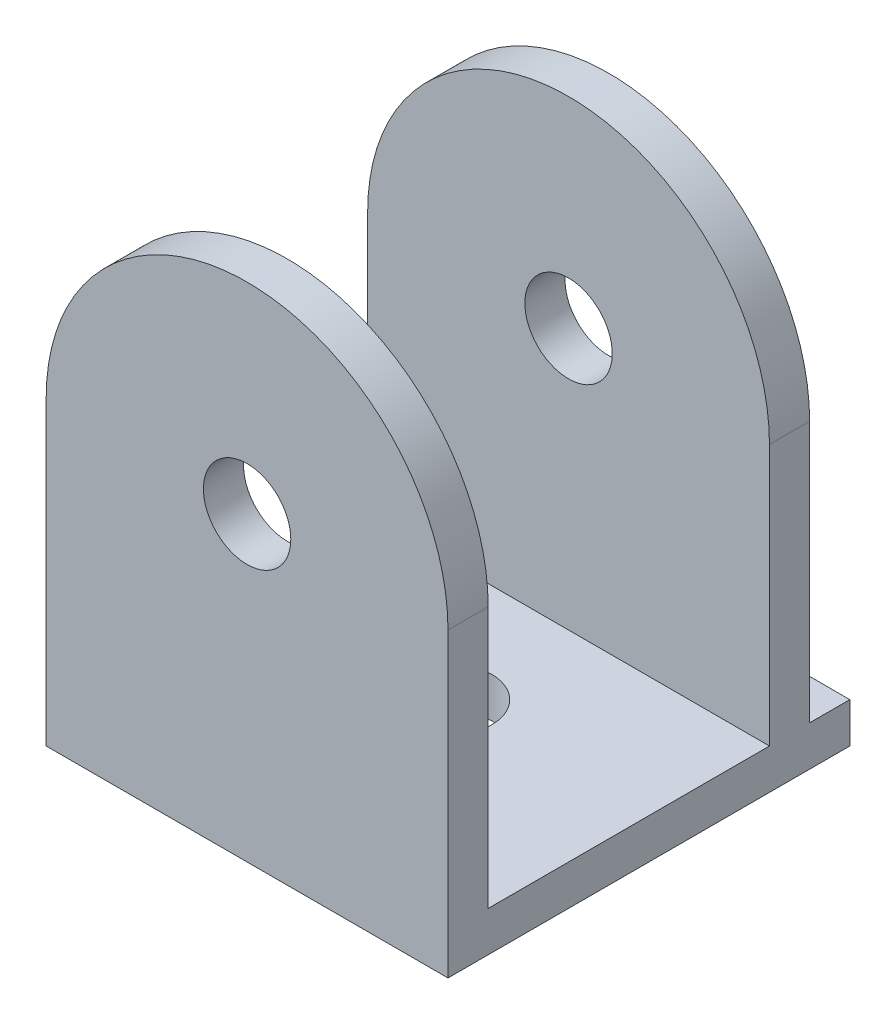
ISO-10303-21;
HEADER;
FILE_DESCRIPTION(('STEP AP214'),'2;1');
FILE_NAME('part.step','',(''),(''),'','','');
FILE_SCHEMA(('AUTOMOTIVE_DESIGN { 1 0 10303 214 1 1 1 1 }'));
ENDSEC;
DATA;
#1=APPLICATION_CONTEXT('core data for automotive mechanical design processes');
#2=APPLICATION_PROTOCOL_DEFINITION('international standard','automotive_design',2000,#1);
#3=PRODUCT_CONTEXT('',#1,'mechanical');
#4=PRODUCT('Part','Part','',(#3));
#5=PRODUCT_RELATED_PRODUCT_CATEGORY('part','',(#4));
#6=PRODUCT_DEFINITION_FORMATION('','',#4);
#7=PRODUCT_DEFINITION_CONTEXT('part definition',#1,'design');
#8=PRODUCT_DEFINITION('design','',#6,#7);
#9=PRODUCT_DEFINITION_SHAPE('','',#8);
#10=(LENGTH_UNIT() NAMED_UNIT(*) SI_UNIT(.MILLI.,.METRE.));
#11=(NAMED_UNIT(*) PLANE_ANGLE_UNIT() SI_UNIT($,.RADIAN.));
#12=(NAMED_UNIT(*) SI_UNIT($,.STERADIAN.) SOLID_ANGLE_UNIT());
#13=UNCERTAINTY_MEASURE_WITH_UNIT(LENGTH_MEASURE(1.E-05),#10,'distance_accuracy_value','');
#14=(GEOMETRIC_REPRESENTATION_CONTEXT(3) GLOBAL_UNCERTAINTY_ASSIGNED_CONTEXT((#13)) GLOBAL_UNIT_ASSIGNED_CONTEXT((#10,
#11,#12)) REPRESENTATION_CONTEXT('',''));
#15=CARTESIAN_POINT('',(0.,0.,0.));
#16=DIRECTION('',(0.,0.,1.));
#17=DIRECTION('',(1.,0.,0.));
#18=AXIS2_PLACEMENT_3D('',#15,#16,#17);
#19=CARTESIAN_POINT('',(0.,30.,20.));
#20=DIRECTION('',(0.,0.,-1.));
#21=DIRECTION('',(-1.,0.,0.));
#22=AXIS2_PLACEMENT_3D('',#19,#20,#21);
#23=CYLINDRICAL_SURFACE('',#22,20.);
#24=CARTESIAN_POINT('',(0.,30.,16.));
#25=DIRECTION('',(0.,0.,1.));
#26=DIRECTION('',(0.,-1.,0.));
#27=AXIS2_PLACEMENT_3D('',#24,#25,#26);
#28=CIRCLE('',#27,20.);
#29=CARTESIAN_POINT('',(-20.,30.,16.));
#30=VERTEX_POINT('',#29);
#31=CARTESIAN_POINT('',(20.,30.,16.));
#32=VERTEX_POINT('',#31);
#33=EDGE_CURVE('E166',#30,#32,#28,.F.);
#34=ORIENTED_EDGE('',*,*,#33,.F.);
#35=DIRECTION('',(0.,0.,-1.));
#36=VECTOR('',#35,1.);
#37=CARTESIAN_POINT('',(-20.,30.,20.));
#38=LINE('',#37,#36);
#39=CARTESIAN_POINT('',(-20.,30.,20.));
#40=VERTEX_POINT('',#39);
#41=EDGE_CURVE('E49',#40,#30,#38,.T.);
#42=ORIENTED_EDGE('',*,*,#41,.F.);
#43=CARTESIAN_POINT('',(0.,30.,20.));
#44=DIRECTION('',(0.,0.,1.));
#45=DIRECTION('',(1.,0.,0.));
#46=AXIS2_PLACEMENT_3D('',#43,#44,#45);
#47=CIRCLE('',#46,20.);
#48=CARTESIAN_POINT('',(20.,30.,20.));
#49=VERTEX_POINT('',#48);
#50=EDGE_CURVE('E171',#40,#49,#47,.F.);
#51=ORIENTED_EDGE('',*,*,#50,.T.);
#52=DIRECTION('',(0.,0.,-1.));
#53=VECTOR('',#52,1.);
#54=CARTESIAN_POINT('',(20.,30.,20.));
#55=LINE('',#54,#53);
#56=EDGE_CURVE('E190',#49,#32,#55,.T.);
#57=ORIENTED_EDGE('',*,*,#56,.T.);
#58=EDGE_LOOP('',(#34,#42,#51,#57));
#59=FACE_BOUND('',#58,.T.);
#60=ADVANCED_FACE('F41',(#59),#23,.T.);
#61=CARTESIAN_POINT('',(0.,30.,-12.));
#62=DIRECTION('',(0.,0.,-1.));
#63=DIRECTION('',(0.,1.,0.));
#64=AXIS2_PLACEMENT_3D('',#61,#62,#63);
#65=CIRCLE('',#64,20.);
#66=CARTESIAN_POINT('',(20.,30.,-12.));
#67=VERTEX_POINT('',#66);
#68=CARTESIAN_POINT('',(-20.,30.,-12.));
#69=VERTEX_POINT('',#68);
#70=EDGE_CURVE('E168',#67,#69,#65,.F.);
#71=ORIENTED_EDGE('',*,*,#70,.F.);
#72=CARTESIAN_POINT('',(20.,30.,-16.));
#73=VERTEX_POINT('',#72);
#74=EDGE_CURVE('E142',#67,#73,#55,.T.);
#75=ORIENTED_EDGE('',*,*,#74,.T.);
#76=CARTESIAN_POINT('',(0.,30.,-16.));
#77=DIRECTION('',(0.,0.,1.));
#78=DIRECTION('',(0.,-1.,0.));
#79=AXIS2_PLACEMENT_3D('',#76,#77,#78);
#80=CIRCLE('',#79,20.);
#81=CARTESIAN_POINT('',(-20.,30.,-16.));
#82=VERTEX_POINT('',#81);
#83=EDGE_CURVE('E128',#82,#73,#80,.F.);
#84=ORIENTED_EDGE('',*,*,#83,.F.);
#85=EDGE_CURVE('E197',#69,#82,#38,.T.);
#86=ORIENTED_EDGE('',*,*,#85,.F.);
#87=EDGE_LOOP('',(#71,#75,#84,#86));
#88=FACE_BOUND('',#87,.T.);
#89=ADVANCED_FACE('F43',(#88),#23,.T.);
#90=CARTESIAN_POINT('',(-20.,0.,20.));
#91=DIRECTION('',(1.,0.,0.));
#92=DIRECTION('',(0.,0.,-1.));
#93=AXIS2_PLACEMENT_3D('',#90,#91,#92);
#94=PLANE('',#93);
#95=ORIENTED_EDGE('',*,*,#41,.T.);
#96=DIRECTION('',(0.,-1.,0.));
#97=VECTOR('',#96,1.);
#98=CARTESIAN_POINT('',(-20.,50.,16.));
#99=LINE('',#98,#97);
#100=CARTESIAN_POINT('',(-20.,4.,16.));
#101=VERTEX_POINT('',#100);
#102=EDGE_CURVE('E145',#30,#101,#99,.T.);
#103=ORIENTED_EDGE('',*,*,#102,.T.);
#104=DIRECTION('',(0.,0.,-1.));
#105=VECTOR('',#104,1.);
#106=CARTESIAN_POINT('',(-20.,4.,16.));
#107=LINE('',#106,#105);
#108=CARTESIAN_POINT('',(-20.,4.,-12.));
#109=VERTEX_POINT('',#108);
#110=EDGE_CURVE('E143',#101,#109,#107,.T.);
#111=ORIENTED_EDGE('',*,*,#110,.T.);
#112=DIRECTION('',(0.,1.,0.));
#113=VECTOR('',#112,1.);
#114=CARTESIAN_POINT('',(-20.,50.,-12.));
#115=LINE('',#114,#113);
#116=EDGE_CURVE('E126',#109,#69,#115,.T.);
#117=ORIENTED_EDGE('',*,*,#116,.T.);
#118=ORIENTED_EDGE('',*,*,#85,.T.);
#119=DIRECTION('',(0.,-1.,0.));
#120=VECTOR('',#119,1.);
#121=CARTESIAN_POINT('',(-20.,50.,-16.));
#122=LINE('',#121,#120);
#123=CARTESIAN_POINT('',(-20.,4.,-16.));
#124=VERTEX_POINT('',#123);
#125=EDGE_CURVE('E156',#82,#124,#122,.T.);
#126=ORIENTED_EDGE('',*,*,#125,.T.);
#127=DIRECTION('',(0.,0.,-1.));
#128=VECTOR('',#127,1.);
#129=CARTESIAN_POINT('',(-20.,4.,-20.));
#130=LINE('',#129,#128);
#131=CARTESIAN_POINT('',(-20.,4.,-20.));
#132=VERTEX_POINT('',#131);
#133=EDGE_CURVE('E151',#124,#132,#130,.T.);
#134=ORIENTED_EDGE('',*,*,#133,.T.);
#135=DIRECTION('',(0.,-1.,0.));
#136=VECTOR('',#135,1.);
#137=CARTESIAN_POINT('',(-20.,0.,-20.));
#138=LINE('',#137,#136);
#139=CARTESIAN_POINT('',(-20.,0.,-20.));
#140=VERTEX_POINT('',#139);
#141=EDGE_CURVE('E167',#132,#140,#138,.T.);
#142=ORIENTED_EDGE('',*,*,#141,.T.);
#143=DIRECTION('',(0.,0.,-1.));
#144=VECTOR('',#143,1.);
#145=CARTESIAN_POINT('',(-20.,0.,20.));
#146=LINE('',#145,#144);
#147=CARTESIAN_POINT('',(-20.,0.,20.));
#148=VERTEX_POINT('',#147);
#149=EDGE_CURVE('E195',#148,#140,#146,.T.);
#150=ORIENTED_EDGE('',*,*,#149,.F.);
#151=DIRECTION('',(0.,-1.,0.));
#152=VECTOR('',#151,1.);
#153=CARTESIAN_POINT('',(-20.,0.,20.));
#154=LINE('',#153,#152);
#155=EDGE_CURVE('E172',#40,#148,#154,.T.);
#156=ORIENTED_EDGE('',*,*,#155,.F.);
#157=EDGE_LOOP('',(#95,#103,#111,#117,#118,#126,#134,#142,#150,#156));
#158=FACE_BOUND('',#157,.T.);
#159=ADVANCED_FACE('F234',(#158),#94,.F.);
#160=CARTESIAN_POINT('',(0.,0.,20.));
#161=DIRECTION('',(0.,1.,0.));
#162=DIRECTION('',(0.,0.,1.));
#163=AXIS2_PLACEMENT_3D('',#160,#161,#162);
#164=PLANE('',#163);
#165=CARTESIAN_POINT('',(0.,0.,0.));
#166=DIRECTION('',(0.,-1.,0.));
#167=DIRECTION('',(0.,0.,-1.));
#168=AXIS2_PLACEMENT_3D('',#165,#166,#167);
#169=CIRCLE('',#168,4.35);
#170=CARTESIAN_POINT('',(0.,0.,-4.35));
#171=VERTEX_POINT('',#170);
#172=EDGE_CURVE('E210',#171,#171,#169,.T.);
#173=ORIENTED_EDGE('',*,*,#172,.F.);
#174=EDGE_LOOP('',(#173));
#175=FACE_BOUND('',#174,.T.);
#176=DIRECTION('',(1.,0.,0.));
#177=VECTOR('',#176,1.);
#178=CARTESIAN_POINT('',(0.,0.,-20.));
#179=LINE('',#178,#177);
#180=CARTESIAN_POINT('',(20.,0.,-20.));
#181=VERTEX_POINT('',#180);
#182=EDGE_CURVE('E182',#140,#181,#179,.T.);
#183=ORIENTED_EDGE('',*,*,#182,.T.);
#184=DIRECTION('',(0.,0.,-1.));
#185=VECTOR('',#184,1.);
#186=CARTESIAN_POINT('',(20.,0.,20.));
#187=LINE('',#186,#185);
#188=CARTESIAN_POINT('',(20.,0.,20.));
#189=VERTEX_POINT('',#188);
#190=EDGE_CURVE('E188',#189,#181,#187,.T.);
#191=ORIENTED_EDGE('',*,*,#190,.F.);
#192=DIRECTION('',(1.,0.,0.));
#193=VECTOR('',#192,1.);
#194=CARTESIAN_POINT('',(0.,0.,20.));
#195=LINE('',#194,#193);
#196=EDGE_CURVE('E180',#148,#189,#195,.T.);
#197=ORIENTED_EDGE('',*,*,#196,.F.);
#198=ORIENTED_EDGE('',*,*,#149,.T.);
#199=EDGE_LOOP('',(#183,#191,#197,#198));
#200=FACE_BOUND('',#199,.T.);
#201=ADVANCED_FACE('F239',(#175,#200),#164,.F.);
#202=CARTESIAN_POINT('',(20.,0.,20.));
#203=DIRECTION('',(1.,0.,0.));
#204=DIRECTION('',(0.,1.,0.));
#205=AXIS2_PLACEMENT_3D('',#202,#203,#204);
#206=PLANE('',#205);
#207=DIRECTION('',(0.,-1.,0.));
#208=VECTOR('',#207,1.);
#209=CARTESIAN_POINT('',(20.,0.,16.));
#210=LINE('',#209,#208);
#211=CARTESIAN_POINT('',(20.,4.,16.));
#212=VERTEX_POINT('',#211);
#213=EDGE_CURVE('E11',#32,#212,#210,.T.);
#214=ORIENTED_EDGE('',*,*,#213,.F.);
#215=ORIENTED_EDGE('',*,*,#56,.F.);
#216=DIRECTION('',(0.,-1.,0.));
#217=VECTOR('',#216,1.);
#218=CARTESIAN_POINT('',(20.,0.,20.));
#219=LINE('',#218,#217);
#220=EDGE_CURVE('E177',#49,#189,#219,.T.);
#221=ORIENTED_EDGE('',*,*,#220,.T.);
#222=ORIENTED_EDGE('',*,*,#190,.T.);
#223=DIRECTION('',(0.,-1.,0.));
#224=VECTOR('',#223,1.);
#225=CARTESIAN_POINT('',(20.,0.,-20.));
#226=LINE('',#225,#224);
#227=CARTESIAN_POINT('',(20.,4.,-20.));
#228=VERTEX_POINT('',#227);
#229=EDGE_CURVE('E174',#228,#181,#226,.T.);
#230=ORIENTED_EDGE('',*,*,#229,.F.);
#231=DIRECTION('',(0.,0.,-1.));
#232=VECTOR('',#231,1.);
#233=CARTESIAN_POINT('',(20.,4.,-20.));
#234=LINE('',#233,#232);
#235=CARTESIAN_POINT('',(20.,4.,-16.));
#236=VERTEX_POINT('',#235);
#237=EDGE_CURVE('E62',#236,#228,#234,.T.);
#238=ORIENTED_EDGE('',*,*,#237,.F.);
#239=DIRECTION('',(0.,-1.,0.));
#240=VECTOR('',#239,1.);
#241=CARTESIAN_POINT('',(20.,50.,-16.));
#242=LINE('',#241,#240);
#243=EDGE_CURVE('E138',#73,#236,#242,.T.);
#244=ORIENTED_EDGE('',*,*,#243,.F.);
#245=ORIENTED_EDGE('',*,*,#74,.F.);
#246=DIRECTION('',(0.,1.,0.));
#247=VECTOR('',#246,1.);
#248=CARTESIAN_POINT('',(20.,50.,-12.));
#249=LINE('',#248,#247);
#250=CARTESIAN_POINT('',(20.,4.,-12.));
#251=VERTEX_POINT('',#250);
#252=EDGE_CURVE('E121',#251,#67,#249,.T.);
#253=ORIENTED_EDGE('',*,*,#252,.F.);
#254=DIRECTION('',(0.,0.,-1.));
#255=VECTOR('',#254,1.);
#256=CARTESIAN_POINT('',(20.,4.,16.));
#257=LINE('',#256,#255);
#258=EDGE_CURVE('E135',#212,#251,#257,.T.);
#259=ORIENTED_EDGE('',*,*,#258,.F.);
#260=EDGE_LOOP('',(#214,#215,#221,#222,#230,#238,#244,#245,#253,#259));
#261=FACE_BOUND('',#260,.T.);
#262=ADVANCED_FACE('F137',(#261),#206,.T.);
#263=CARTESIAN_POINT('',(0.,0.,20.));
#264=DIRECTION('',(0.,0.,1.));
#265=DIRECTION('',(1.,0.,0.));
#266=AXIS2_PLACEMENT_3D('',#263,#264,#265);
#267=PLANE('',#266);
#268=CARTESIAN_POINT('',(0.,30.,20.));
#269=DIRECTION('',(0.,0.,1.));
#270=DIRECTION('',(1.,0.,0.));
#271=AXIS2_PLACEMENT_3D('',#268,#269,#270);
#272=CIRCLE('',#271,4.35);
#273=CARTESIAN_POINT('',(4.34999999999999,30.,20.));
#274=VERTEX_POINT('',#273);
#275=EDGE_CURVE('E159',#274,#274,#272,.T.);
#276=ORIENTED_EDGE('',*,*,#275,.F.);
#277=EDGE_LOOP('',(#276));
#278=FACE_BOUND('',#277,.T.);
#279=ORIENTED_EDGE('',*,*,#50,.F.);
#280=ORIENTED_EDGE('',*,*,#155,.T.);
#281=ORIENTED_EDGE('',*,*,#196,.T.);
#282=ORIENTED_EDGE('',*,*,#220,.F.);
#283=EDGE_LOOP('',(#279,#280,#281,#282));
#284=FACE_BOUND('',#283,.T.);
#285=ADVANCED_FACE('F224',(#278,#284),#267,.T.);
#286=CARTESIAN_POINT('',(0.,0.,-20.));
#287=DIRECTION('',(0.,0.,1.));
#288=DIRECTION('',(1.,0.,0.));
#289=AXIS2_PLACEMENT_3D('',#286,#287,#288);
#290=PLANE('',#289);
#291=ORIENTED_EDGE('',*,*,#141,.F.);
#292=DIRECTION('',(1.,0.,0.));
#293=VECTOR('',#292,1.);
#294=CARTESIAN_POINT('',(-20.,4.,-20.));
#295=LINE('',#294,#293);
#296=EDGE_CURVE('E153',#132,#228,#295,.T.);
#297=ORIENTED_EDGE('',*,*,#296,.T.);
#298=ORIENTED_EDGE('',*,*,#229,.T.);
#299=ORIENTED_EDGE('',*,*,#182,.F.);
#300=EDGE_LOOP('',(#291,#297,#298,#299));
#301=FACE_BOUND('',#300,.T.);
#302=ADVANCED_FACE('F221',(#301),#290,.F.);
#303=CARTESIAN_POINT('',(-20.,4.,-20.));
#304=DIRECTION('',(0.,-1.,0.));
#305=DIRECTION('',(0.,0.,-1.));
#306=AXIS2_PLACEMENT_3D('',#303,#304,#305);
#307=PLANE('',#306);
#308=ORIENTED_EDGE('',*,*,#296,.F.);
#309=ORIENTED_EDGE('',*,*,#133,.F.);
#310=DIRECTION('',(1.,0.,0.));
#311=VECTOR('',#310,1.);
#312=CARTESIAN_POINT('',(-20.,4.,-16.));
#313=LINE('',#312,#311);
#314=EDGE_CURVE('E155',#124,#236,#313,.T.);
#315=ORIENTED_EDGE('',*,*,#314,.T.);
#316=ORIENTED_EDGE('',*,*,#237,.T.);
#317=EDGE_LOOP('',(#308,#309,#315,#316));
#318=FACE_BOUND('',#317,.T.);
#319=ADVANCED_FACE('F255',(#318),#307,.F.);
#320=CARTESIAN_POINT('',(-20.,50.,-16.));
#321=DIRECTION('',(0.,0.,1.));
#322=DIRECTION('',(0.,-1.,0.));
#323=AXIS2_PLACEMENT_3D('',#320,#321,#322);
#324=PLANE('',#323);
#325=CARTESIAN_POINT('',(0.,30.,-16.));
#326=DIRECTION('',(0.,0.,1.));
#327=DIRECTION('',(0.,-1.,0.));
#328=AXIS2_PLACEMENT_3D('',#325,#326,#327);
#329=CIRCLE('',#328,4.35);
#330=CARTESIAN_POINT('',(0.,25.65,-16.));
#331=VERTEX_POINT('',#330);
#332=EDGE_CURVE('E205',#331,#331,#329,.T.);
#333=ORIENTED_EDGE('',*,*,#332,.T.);
#334=EDGE_LOOP('',(#333));
#335=FACE_BOUND('',#334,.T.);
#336=ORIENTED_EDGE('',*,*,#83,.T.);
#337=ORIENTED_EDGE('',*,*,#243,.T.);
#338=ORIENTED_EDGE('',*,*,#314,.F.);
#339=ORIENTED_EDGE('',*,*,#125,.F.);
#340=EDGE_LOOP('',(#336,#337,#338,#339));
#341=FACE_BOUND('',#340,.T.);
#342=ADVANCED_FACE('F248',(#335,#341),#324,.F.);
#343=CARTESIAN_POINT('',(-20.,50.,16.));
#344=DIRECTION('',(0.,0.,1.));
#345=DIRECTION('',(0.,-1.,0.));
#346=AXIS2_PLACEMENT_3D('',#343,#344,#345);
#347=PLANE('',#346);
#348=CARTESIAN_POINT('',(0.,30.,16.));
#349=DIRECTION('',(0.,0.,1.));
#350=DIRECTION('',(0.,-1.,0.));
#351=AXIS2_PLACEMENT_3D('',#348,#349,#350);
#352=CIRCLE('',#351,4.35);
#353=CARTESIAN_POINT('',(0.,25.65,16.));
#354=VERTEX_POINT('',#353);
#355=EDGE_CURVE('E198',#354,#354,#352,.T.);
#356=ORIENTED_EDGE('',*,*,#355,.T.);
#357=EDGE_LOOP('',(#356));
#358=FACE_BOUND('',#357,.T.);
#359=ORIENTED_EDGE('',*,*,#33,.T.);
#360=ORIENTED_EDGE('',*,*,#213,.T.);
#361=DIRECTION('',(1.,0.,0.));
#362=VECTOR('',#361,1.);
#363=CARTESIAN_POINT('',(-20.,4.,16.));
#364=LINE('',#363,#362);
#365=EDGE_CURVE('E59',#101,#212,#364,.T.);
#366=ORIENTED_EDGE('',*,*,#365,.F.);
#367=ORIENTED_EDGE('',*,*,#102,.F.);
#368=EDGE_LOOP('',(#359,#360,#366,#367));
#369=FACE_BOUND('',#368,.T.);
#370=ADVANCED_FACE('F243',(#358,#369),#347,.F.);
#371=CARTESIAN_POINT('',(-20.,50.,-12.));
#372=DIRECTION('',(0.,0.,-1.));
#373=DIRECTION('',(0.,1.,0.));
#374=AXIS2_PLACEMENT_3D('',#371,#372,#373);
#375=PLANE('',#374);
#376=CARTESIAN_POINT('',(0.,30.,-12.));
#377=DIRECTION('',(0.,0.,-1.));
#378=DIRECTION('',(0.,1.,0.));
#379=AXIS2_PLACEMENT_3D('',#376,#377,#378);
#380=CIRCLE('',#379,4.35);
#381=CARTESIAN_POINT('',(0.,34.35,-12.));
#382=VERTEX_POINT('',#381);
#383=EDGE_CURVE('E199',#382,#382,#380,.T.);
#384=ORIENTED_EDGE('',*,*,#383,.T.);
#385=EDGE_LOOP('',(#384));
#386=FACE_BOUND('',#385,.T.);
#387=ORIENTED_EDGE('',*,*,#70,.T.);
#388=ORIENTED_EDGE('',*,*,#116,.F.);
#389=DIRECTION('',(1.,0.,0.));
#390=VECTOR('',#389,1.);
#391=CARTESIAN_POINT('',(-20.,4.,-12.));
#392=LINE('',#391,#390);
#393=EDGE_CURVE('E122',#109,#251,#392,.T.);
#394=ORIENTED_EDGE('',*,*,#393,.T.);
#395=ORIENTED_EDGE('',*,*,#252,.T.);
#396=EDGE_LOOP('',(#387,#388,#394,#395));
#397=FACE_BOUND('',#396,.T.);
#398=ADVANCED_FACE('F125',(#386,#397),#375,.F.);
#399=CARTESIAN_POINT('',(-20.,4.,16.));
#400=DIRECTION('',(0.,-1.,0.));
#401=DIRECTION('',(0.,0.,-1.));
#402=AXIS2_PLACEMENT_3D('',#399,#400,#401);
#403=PLANE('',#402);
#404=CARTESIAN_POINT('',(0.,4.,0.));
#405=DIRECTION('',(0.,-1.,0.));
#406=DIRECTION('',(0.,0.,-1.));
#407=AXIS2_PLACEMENT_3D('',#404,#405,#406);
#408=CIRCLE('',#407,4.35);
#409=CARTESIAN_POINT('',(0.,4.,-4.35));
#410=VERTEX_POINT('',#409);
#411=EDGE_CURVE('E44',#410,#410,#408,.T.);
#412=ORIENTED_EDGE('',*,*,#411,.T.);
#413=EDGE_LOOP('',(#412));
#414=FACE_BOUND('',#413,.T.);
#415=ORIENTED_EDGE('',*,*,#393,.F.);
#416=ORIENTED_EDGE('',*,*,#110,.F.);
#417=ORIENTED_EDGE('',*,*,#365,.T.);
#418=ORIENTED_EDGE('',*,*,#258,.T.);
#419=EDGE_LOOP('',(#415,#416,#417,#418));
#420=FACE_BOUND('',#419,.T.);
#421=ADVANCED_FACE('F134',(#414,#420),#403,.F.);
#422=CARTESIAN_POINT('',(0.,30.,-20.));
#423=DIRECTION('',(0.,0.,1.));
#424=DIRECTION('',(1.,0.,0.));
#425=AXIS2_PLACEMENT_3D('',#422,#423,#424);
#426=CYLINDRICAL_SURFACE('',#425,4.35);
#427=ORIENTED_EDGE('',*,*,#383,.F.);
#428=EDGE_LOOP('',(#427));
#429=FACE_BOUND('',#428,.T.);
#430=ORIENTED_EDGE('',*,*,#332,.F.);
#431=EDGE_LOOP('',(#430));
#432=FACE_BOUND('',#431,.T.);
#433=ADVANCED_FACE('F328',(#429,#432),#426,.F.);
#434=ORIENTED_EDGE('',*,*,#275,.T.);
#435=EDGE_LOOP('',(#434));
#436=FACE_BOUND('',#435,.T.);
#437=ORIENTED_EDGE('',*,*,#355,.F.);
#438=EDGE_LOOP('',(#437));
#439=FACE_BOUND('',#438,.T.);
#440=ADVANCED_FACE('F216',(#436,#439),#426,.F.);
#441=CARTESIAN_POINT('',(0.,50.,0.));
#442=DIRECTION('',(0.,-1.,0.));
#443=DIRECTION('',(0.,0.,-1.));
#444=AXIS2_PLACEMENT_3D('',#441,#442,#443);
#445=CYLINDRICAL_SURFACE('',#444,4.35);
#446=CARTESIAN_POINT('',(0.,0.,-4.35));
#447=CARTESIAN_POINT('',(0.,0.0416666666666667,-4.35));
#448=CARTESIAN_POINT('',(0.,0.0833333333333334,-4.35));
#449=CARTESIAN_POINT('',(0.,0.166666666666667,-4.35));
#450=CARTESIAN_POINT('',(0.,0.208333333333334,-4.35));
#451=CARTESIAN_POINT('',(0.,0.291666666666667,-4.35));
#452=CARTESIAN_POINT('',(0.,0.333333333333334,-4.35));
#453=CARTESIAN_POINT('',(0.,0.416666666666667,-4.35));
#454=CARTESIAN_POINT('',(0.,0.458333333333334,-4.35));
#455=CARTESIAN_POINT('',(0.,0.541666666666667,-4.35));
#456=CARTESIAN_POINT('',(0.,0.583333333333334,-4.35));
#457=CARTESIAN_POINT('',(0.,0.666666666666667,-4.35));
#458=CARTESIAN_POINT('',(0.,0.708333333333334,-4.35));
#459=CARTESIAN_POINT('',(0.,0.791666666666667,-4.35));
#460=CARTESIAN_POINT('',(0.,0.833333333333334,-4.35));
#461=CARTESIAN_POINT('',(0.,0.916666666666668,-4.35));
#462=CARTESIAN_POINT('',(0.,0.958333333333334,-4.35));
#463=CARTESIAN_POINT('',(0.,1.04166666666667,-4.35));
#464=CARTESIAN_POINT('',(0.,1.08333333333333,-4.35));
#465=CARTESIAN_POINT('',(0.,1.16666666666667,-4.35));
#466=CARTESIAN_POINT('',(0.,1.20833333333333,-4.35));
#467=CARTESIAN_POINT('',(0.,1.29166666666667,-4.35));
#468=CARTESIAN_POINT('',(0.,1.33333333333333,-4.35));
#469=CARTESIAN_POINT('',(0.,1.41666666666667,-4.35));
#470=CARTESIAN_POINT('',(0.,1.45833333333333,-4.35));
#471=CARTESIAN_POINT('',(0.,1.54166666666667,-4.35));
#472=CARTESIAN_POINT('',(0.,1.58333333333333,-4.35));
#473=CARTESIAN_POINT('',(0.,1.66666666666667,-4.35));
#474=CARTESIAN_POINT('',(0.,1.70833333333333,-4.35));
#475=CARTESIAN_POINT('',(0.,1.79166666666667,-4.35));
#476=CARTESIAN_POINT('',(0.,1.83333333333334,-4.35));
#477=CARTESIAN_POINT('',(0.,1.91666666666667,-4.35));
#478=CARTESIAN_POINT('',(0.,1.95833333333334,-4.35));
#479=CARTESIAN_POINT('',(0.,2.04166666666667,-4.35));
#480=CARTESIAN_POINT('',(0.,2.08333333333334,-4.35));
#481=CARTESIAN_POINT('',(0.,2.16666666666667,-4.35));
#482=CARTESIAN_POINT('',(0.,2.20833333333334,-4.35));
#483=CARTESIAN_POINT('',(0.,2.29166666666667,-4.35));
#484=CARTESIAN_POINT('',(0.,2.33333333333334,-4.35));
#485=CARTESIAN_POINT('',(0.,2.41666666666667,-4.35));
#486=CARTESIAN_POINT('',(0.,2.45833333333334,-4.35));
#487=CARTESIAN_POINT('',(0.,2.54166666666667,-4.35));
#488=CARTESIAN_POINT('',(0.,2.58333333333334,-4.35));
#489=CARTESIAN_POINT('',(0.,2.66666666666667,-4.35));
#490=CARTESIAN_POINT('',(0.,2.70833333333334,-4.35));
#491=CARTESIAN_POINT('',(0.,2.79166666666667,-4.35));
#492=CARTESIAN_POINT('',(0.,2.83333333333334,-4.35));
#493=CARTESIAN_POINT('',(0.,2.91666666666667,-4.35));
#494=CARTESIAN_POINT('',(0.,2.95833333333334,-4.35));
#495=CARTESIAN_POINT('',(0.,3.04166666666667,-4.35));
#496=CARTESIAN_POINT('',(0.,3.08333333333334,-4.35));
#497=CARTESIAN_POINT('',(0.,3.16666666666667,-4.35));
#498=CARTESIAN_POINT('',(0.,3.20833333333334,-4.35));
#499=CARTESIAN_POINT('',(0.,3.29166666666667,-4.35));
#500=CARTESIAN_POINT('',(0.,3.33333333333334,-4.35));
#501=CARTESIAN_POINT('',(0.,3.41666666666667,-4.35));
#502=CARTESIAN_POINT('',(0.,3.45833333333334,-4.35));
#503=CARTESIAN_POINT('',(0.,3.54166666666667,-4.35));
#504=CARTESIAN_POINT('',(0.,3.58333333333334,-4.35));
#505=CARTESIAN_POINT('',(0.,3.66666666666667,-4.35));
#506=CARTESIAN_POINT('',(0.,3.70833333333334,-4.35));
#507=CARTESIAN_POINT('',(0.,3.79166666666667,-4.35));
#508=CARTESIAN_POINT('',(0.,3.83333333333334,-4.35));
#509=CARTESIAN_POINT('',(0.,3.91666666666667,-4.35));
#510=CARTESIAN_POINT('',(0.,3.95833333333334,-4.35));
#511=CARTESIAN_POINT('',(0.,4.,-4.35));
#512=B_SPLINE_CURVE_WITH_KNOTS('',3,(#446,#447,#448,#449,#450,#451,#452,#453,#454,#455,#456,
#457,#458,#459,#460,#461,#462,#463,#464,#465,#466,#467,#468,#469,#470,#471,#472,#473,#474,#475,
#476,#477,#478,#479,#480,#481,#482,#483,#484,#485,#486,#487,#488,#489,#490,#491,#492,#493,#494,
#495,#496,#497,#498,#499,#500,#501,#502,#503,#504,#505,#506,#507,#508,#509,#510,#511),
.UNSPECIFIED.,.F.,.F.,(4,2,2,2,2,2,2,2,2,2,2,2,2,2,2,2,2,2,2,2,2,2,2,2,2,2,2,2,2,2,2,2,4),(0.,
0.125,0.25,0.375,0.5,0.625000000000001,0.750000000000001,0.875000000000001,1.,1.125,1.25,1.375,
1.5,1.625,1.75,1.875,2.,2.125,2.25,2.375,2.5,2.625,2.75,2.875,3.,3.125,3.25,3.375,3.5,3.625,
3.75,3.875,4.),.UNSPECIFIED.);
#513=EDGE_CURVE('BSEAM349',#171,#410,#512,.T.);
#514=ORIENTED_EDGE('',*,*,#172,.T.);
#515=ORIENTED_EDGE('',*,*,#411,.F.);
#516=ORIENTED_EDGE('',*,*,#513,.T.);
#517=ORIENTED_EDGE('',*,*,#513,.F.);
#518=EDGE_LOOP('',(#514,#516,#515,#517));
#519=FACE_BOUND('',#518,.T.);
#520=ADVANCED_FACE('F349',(#519),#445,.F.);
#521=CLOSED_SHELL('',(#60,#89,#159,#201,#262,#285,#302,#319,#342,#370,#398,#421,#433,#440,#520));
#522=MANIFOLD_SOLID_BREP('B2',#521);
#523=ADVANCED_BREP_SHAPE_REPRESENTATION('',(#18,#522),#14);
#524=SHAPE_DEFINITION_REPRESENTATION(#9,#523);
ENDSEC;
END-ISO-10303-21;
